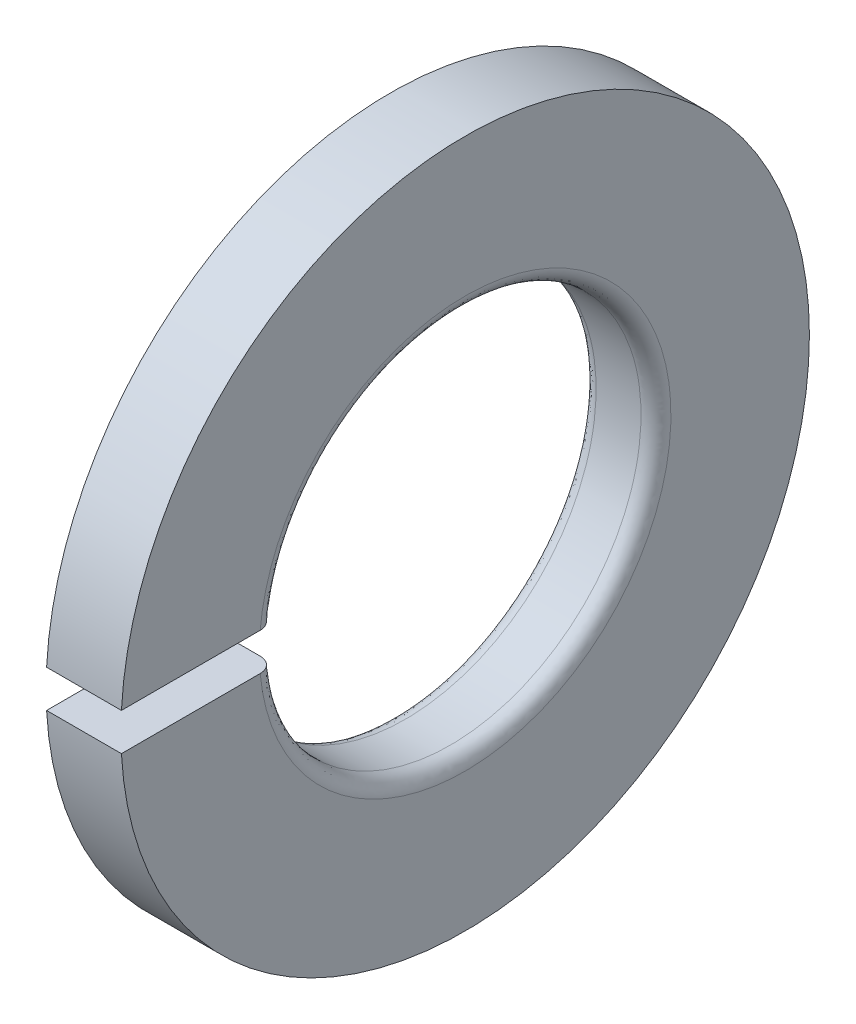
ISO-10303-21;
HEADER;
FILE_DESCRIPTION(('STEP AP214'),'2;1');
FILE_NAME('part.step','',(''),(''),'','','');
FILE_SCHEMA(('AUTOMOTIVE_DESIGN { 1 0 10303 214 1 1 1 1 }'));
ENDSEC;
DATA;
#1=APPLICATION_CONTEXT('core data for automotive mechanical design processes');
#2=APPLICATION_PROTOCOL_DEFINITION('international standard','automotive_design',2000,#1);
#3=PRODUCT_CONTEXT('',#1,'mechanical');
#4=PRODUCT('Part','Part','',(#3));
#5=PRODUCT_RELATED_PRODUCT_CATEGORY('part','',(#4));
#6=PRODUCT_DEFINITION_FORMATION('','',#4);
#7=PRODUCT_DEFINITION_CONTEXT('part definition',#1,'design');
#8=PRODUCT_DEFINITION('design','',#6,#7);
#9=PRODUCT_DEFINITION_SHAPE('','',#8);
#10=(LENGTH_UNIT() NAMED_UNIT(*) SI_UNIT(.MILLI.,.METRE.));
#11=(NAMED_UNIT(*) PLANE_ANGLE_UNIT() SI_UNIT($,.RADIAN.));
#12=(NAMED_UNIT(*) SI_UNIT($,.STERADIAN.) SOLID_ANGLE_UNIT());
#13=UNCERTAINTY_MEASURE_WITH_UNIT(LENGTH_MEASURE(1.E-05),#10,'distance_accuracy_value','');
#14=(GEOMETRIC_REPRESENTATION_CONTEXT(3) GLOBAL_UNCERTAINTY_ASSIGNED_CONTEXT((#13)) GLOBAL_UNIT_ASSIGNED_CONTEXT((#10,
#11,#12)) REPRESENTATION_CONTEXT('',''));
#15=CARTESIAN_POINT('',(0.,0.,0.));
#16=DIRECTION('',(0.,0.,1.));
#17=DIRECTION('',(1.,0.,0.));
#18=AXIS2_PLACEMENT_3D('',#15,#16,#17);
#19=CARTESIAN_POINT('',(-0.2,0.,0.));
#20=DIRECTION('',(-1.,0.,0.));
#21=DIRECTION('',(0.,0.,1.));
#22=AXIS2_PLACEMENT_3D('',#19,#20,#21);
#23=CYLINDRICAL_SURFACE('',#22,2.55);
#24=DIRECTION('',(-1.,0.,0.));
#25=VECTOR('',#24,1.);
#26=CARTESIAN_POINT('',(-0.5,-0.25,2.537715508));
#27=LINE('',#26,#25);
#28=CARTESIAN_POINT('',(-0.19999999981299,-0.25,2.537715508));
#29=VERTEX_POINT('',#28);
#30=CARTESIAN_POINT('',(-0.800000000280313,-0.25,2.53771550557416));
#31=VERTEX_POINT('',#30);
#32=EDGE_CURVE('E65',#29,#31,#27,.T.);
#33=ORIENTED_EDGE('',*,*,#32,.F.);
#34=CARTESIAN_POINT('',(-0.199999999625981,0.,-5.16164801872554E-09));
#35=DIRECTION('',(-1.,0.,0.));
#36=DIRECTION('',(0.,-1.,0.));
#37=AXIS2_PLACEMENT_3D('',#34,#35,#36);
#38=CIRCLE('',#37,2.55000000003291);
#39=CARTESIAN_POINT('',(-0.19999999981299,0.250000000483639,2.53771550547797));
#40=VERTEX_POINT('',#39);
#41=EDGE_CURVE('E87',#40,#29,#38,.T.);
#42=ORIENTED_EDGE('',*,*,#41,.F.);
#43=DIRECTION('',(1.,0.,0.));
#44=VECTOR('',#43,1.);
#45=CARTESIAN_POINT('',(-0.5,0.250000000967278,2.53771550799461));
#46=LINE('',#45,#44);
#47=CARTESIAN_POINT('',(-0.800000000186877,0.250000000483639,2.53771550547797));
#48=VERTEX_POINT('',#47);
#49=EDGE_CURVE('E70',#40,#48,#46,.F.);
#50=ORIENTED_EDGE('',*,*,#49,.T.);
#51=CARTESIAN_POINT('',(-0.800000000373751,0.,-5.16165452393857E-09));
#52=DIRECTION('',(1.,0.,0.));
#53=DIRECTION('',(0.,0.,-1.));
#54=AXIS2_PLACEMENT_3D('',#51,#52,#53);
#55=CIRCLE('',#54,2.55000000003292);
#56=EDGE_CURVE('E68',#31,#48,#55,.T.);
#57=ORIENTED_EDGE('',*,*,#56,.F.);
#58=EDGE_LOOP('',(#33,#42,#50,#57));
#59=FACE_BOUND('',#58,.T.);
#60=ADVANCED_FACE('F16',(#59),#23,.F.);
#61=CARTESIAN_POINT('',(-0.780033317,0.138777453,2.547221539));
#62=CARTESIAN_POINT('',(-0.780033317,4.968494374,2.284089416));
#63=CARTESIAN_POINT('',(-0.780033317,4.836879579,-2.550999167));
#64=CARTESIAN_POINT('',(-0.780033317,0.,-2.550999167));
#65=CARTESIAN_POINT('',(-0.780033317,-4.836879579,-2.550999167));
#66=CARTESIAN_POINT('',(-0.780033317,-4.968494374,2.284089416));
#67=CARTESIAN_POINT('',(-0.780033317,-0.138777453,2.547221539));
#68=CARTESIAN_POINT('',(-0.916010753,0.138035243,2.533598491));
#69=CARTESIAN_POINT('',(-0.916010753,4.941921877,2.271873651));
#70=CARTESIAN_POINT('',(-0.916010753,4.811010984,-2.537355915));
#71=CARTESIAN_POINT('',(-0.916010753,0.,-2.537355915));
#72=CARTESIAN_POINT('',(-0.916010753,-4.811010984,-2.537355915));
#73=CARTESIAN_POINT('',(-0.916010753,-4.941921877,2.271873651));
#74=CARTESIAN_POINT('',(-0.916010753,-0.138035243,2.533598491));
#75=CARTESIAN_POINT('',(-1.012644085,0.143292214,2.630088724));
#76=CARTESIAN_POINT('',(-1.012644085,5.130131333,2.358396286));
#77=CARTESIAN_POINT('',(-1.012644085,4.994234794,-2.633989247));
#78=CARTESIAN_POINT('',(-1.012644085,0.,-2.633989247));
#79=CARTESIAN_POINT('',(-1.012644085,-4.994234794,-2.633989247));
#80=CARTESIAN_POINT('',(-1.012644085,-5.130131333,2.358396286));
#81=CARTESIAN_POINT('',(-1.012644085,-0.143292214,2.630088724));
#82=CARTESIAN_POINT('',(-0.999000833,0.150689551,2.765864799));
#83=CARTESIAN_POINT('',(-0.999000833,5.394969964,2.480146472));
#84=CARTESIAN_POINT('',(-0.999000833,5.252057883,-2.769966683));
#85=CARTESIAN_POINT('',(-0.999000833,0.,-2.769966683));
#86=CARTESIAN_POINT('',(-0.999000833,-5.252057883,-2.769966683));
#87=CARTESIAN_POINT('',(-0.999000833,-5.394969964,2.480146472));
#88=CARTESIAN_POINT('',(-0.999000833,-0.150689551,2.765864799));
#89=(BOUNDED_SURFACE() B_SPLINE_SURFACE(3,3,((#61,#62,#63,#64,#65,#66,#67),(#68,#69,#70,#71,#72,
#73,#74),(#75,#76,#77,#78,#79,#80,#81),(#82,#83,#84,#85,#86,#87,#88)),.UNSPECIFIED.,.F.,.F.,
.F.) B_SPLINE_SURFACE_WITH_KNOTS((4,4),(4,3,4),(0.,1.),(0.,0.5,1.),
.UNSPECIFIED.) GEOMETRIC_REPRESENTATION_ITEM() RATIONAL_B_SPLINE_SURFACE(((1.,0.351473788500957,
0.351473788500957,1.,0.351473788500957,0.351473788500957,1.),(0.755320871106152,
0.265475488101522,0.265475488101522,0.755320871106152,0.265475488101522,0.265475488101522,
0.755320871106152),(0.755320871106152,0.265475488101522,0.265475488101522,0.755320871106152,
0.265475488101522,0.265475488101522,0.755320871106152),(1.,0.351473788500957,0.351473788500957,
1.,0.351473788500957,0.351473788500957,1.))) REPRESENTATION_ITEM('') SURFACE());
#90=CARTESIAN_POINT('',(-1.00000000001159,0.149603339444052,2.74592768641035));
#91=CARTESIAN_POINT('',(-1.00000000001159,5.3560815397739,2.46226889551411));
#92=CARTESIAN_POINT('',(-1.00000000001159,5.21419960824773,-2.75000000292305));
#93=CARTESIAN_POINT('',(-1.00000000001159,0.,-2.75000000292305));
#94=CARTESIAN_POINT('',(-1.00000000001159,-5.21419960824773,-2.75000000292305));
#95=CARTESIAN_POINT('',(-1.00000000001159,-5.3560815397739,2.46226889551411));
#96=CARTESIAN_POINT('',(-1.00000000001159,-0.149603339444052,2.74592768641035));
#97=(BOUNDED_CURVE() B_SPLINE_CURVE(3,(#90,#91,#92,#93,#94,#95,#96),.UNSPECIFIED.,.F.,
.F.) B_SPLINE_CURVE_WITH_KNOTS((4,3,4),(0.,0.5,1.),
.UNSPECIFIED.) CURVE() GEOMETRIC_REPRESENTATION_ITEM() RATIONAL_B_SPLINE_CURVE((0.956578308695323,
0.336212202154983,0.336212202154983,0.956578308695323,0.336212202154983,0.336212202154983,0.956578308695323)) REPRESENTATION_ITEM(''));
#98=CARTESIAN_POINT('',(-1.00000000000464,0.250000000827829,2.73861278928763));
#99=VERTEX_POINT('',#98);
#100=CARTESIAN_POINT('',(-1.00000000000464,-0.250000000827828,2.73861278928763));
#101=VERTEX_POINT('',#100);
#102=EDGE_CURVE('E82',#99,#101,#97,.T.);
#103=CARTESIAN_POINT('',(-0.800000000186876,-0.25,2.53771550818698));
#104=CARTESIAN_POINT('',(-0.811213319520025,-0.249999999999993,2.53770570875092));
#105=CARTESIAN_POINT('',(-0.822423437785705,-0.249999999999997,2.53866251704334));
#106=CARTESIAN_POINT('',(-0.844515758149658,-0.250000000000003,2.54243661608801));
#107=CARTESIAN_POINT('',(-0.855398255077773,-0.250000000000007,2.54525217841151));
#108=CARTESIAN_POINT('',(-0.876540344242708,-0.249999999999994,2.55267289486082));
#109=CARTESIAN_POINT('',(-0.886799666556314,-0.249999999999978,2.55727881816582));
#110=CARTESIAN_POINT('',(-0.906400477665358,-0.250000000000022,2.56814263111236));
#111=CARTESIAN_POINT('',(-0.915742089820553,-0.250000000000081,2.57440029830632));
#112=CARTESIAN_POINT('',(-0.93326824342417,-0.250000000000011,2.58840486343128));
#113=CARTESIAN_POINT('',(-0.941450067824369,-0.249999999999881,2.59615516123982));
#114=CARTESIAN_POINT('',(-0.956403599836143,-0.250000000000119,2.61291412422464));
#115=CARTESIAN_POINT('',(-0.963175277096617,-0.250000000000486,2.62192281647882));
#116=CARTESIAN_POINT('',(-0.975149911855466,-0.250000000000494,2.6409875972027));
#117=CARTESIAN_POINT('',(-0.980345244577474,-0.250000000000132,2.65104846965971));
#118=CARTESIAN_POINT('',(-0.988977880716481,-0.249999999999868,2.67189554575339));
#119=CARTESIAN_POINT('',(-0.992416113925033,-0.249999999999968,2.68268136235035));
#120=CARTESIAN_POINT('',(-0.996614045394206,-0.25000000000002,2.70104230897517));
#121=CARTESIAN_POINT('',(-0.997882954470255,-0.25000000000001,2.70850506331311));
#122=CARTESIAN_POINT('',(-0.999575850091069,-0.24999999999999,2.7235151283908));
#123=CARTESIAN_POINT('',(-1.0000010237238,-0.24999999999998,2.73106230528642));
#124=CARTESIAN_POINT('',(-1.00000000001159,-0.25,2.73861278928763));
#125=B_SPLINE_CURVE_WITH_KNOTS('',3,(#103,#104,#105,#106,#107,#108,#109,#110,#111,#112,#113,
#114,#115,#116,#117,#118,#119,#120,#121,#122,#123,#124),.UNSPECIFIED.,.F.,.F.,(4,2,2,2,2,2,2,2,
2,2,4),(0.,0.0335945579315814,0.0671579206839928,0.100735718974776,0.134308997501819,
0.167959672731201,0.201611072161223,0.235422739622835,0.269216496636191,0.291881473697847,
0.314514539748401),.UNSPECIFIED.);
#126=EDGE_CURVE('E78',#31,#101,#125,.T.);
#127=CARTESIAN_POINT('',(-1.00000000001159,0.25,2.73861278928763));
#128=CARTESIAN_POINT('',(-1.00000937611495,0.249999999999985,2.72727549149672));
#129=CARTESIAN_POINT('',(-0.99904451314827,0.249999999999992,2.71594087843008));
#130=CARTESIAN_POINT('',(-0.995235873774651,0.250000000000008,2.69359932256203));
#131=CARTESIAN_POINT('',(-0.992393365591188,0.250000000000015,2.68259216382774));
#132=CARTESIAN_POINT('',(-0.984896922695982,0.249999999999985,2.66120623322726));
#133=CARTESIAN_POINT('',(-0.980242067653374,0.249999999999947,2.6508277837262));
#134=CARTESIAN_POINT('',(-0.969254808965486,0.250000000000053,2.63100323082644));
#135=CARTESIAN_POINT('',(-0.96292274689501,0.250000000000196,2.62155693812461));
#136=CARTESIAN_POINT('',(-0.948768130436277,0.249999999999848,2.60387949659266));
#137=CARTESIAN_POINT('',(-0.940947840187982,0.249999999999358,2.59564653517358));
#138=CARTESIAN_POINT('',(-0.924030949429694,0.250000000000641,2.58061731863777));
#139=CARTESIAN_POINT('',(-0.914934418423052,0.250000000002414,2.57382098533357));
#140=CARTESIAN_POINT('',(-0.895761509702467,0.250000000002405,2.56188639700259));
#141=CARTESIAN_POINT('',(-0.885689022924804,0.250000000000638,2.5567418840585));
#142=CARTESIAN_POINT('',(-0.864822931140384,0.249999999999362,2.54822820001144));
#143=CARTESIAN_POINT('',(-0.854029802485482,0.249999999999853,2.54485786899391));
#144=CARTESIAN_POINT('',(-0.835971367442596,0.250000000000094,2.54085878488444));
#145=CARTESIAN_POINT('',(-0.82882296536651,0.250000000000047,2.53968077269813));
#146=CARTESIAN_POINT('',(-0.814450745670371,0.249999999999953,2.53810925984432));
#147=CARTESIAN_POINT('',(-0.807227049602917,0.249999999999906,2.5377146471501));
#148=CARTESIAN_POINT('',(-0.800000000186876,0.25,2.53771550818698));
#149=B_SPLINE_CURVE_WITH_KNOTS('',3,(#127,#128,#129,#130,#131,#132,#133,#134,#135,#136,#137,
#138,#139,#140,#141,#142,#143,#144,#145,#146,#147,#148),.UNSPECIFIED.,.F.,.F.,(4,2,2,2,2,2,2,2,
2,2,4),(0.,0.0339671155806587,0.0679113120787765,0.101872768365016,0.135827313476775,
0.16973060839448,0.203632057674078,0.237403513001599,0.271152861912067,0.292847530158628,
0.314511380986703),.UNSPECIFIED.);
#150=EDGE_CURVE('E135',#99,#48,#149,.T.);
#151=ORIENTED_EDGE('',*,*,#102,.T.);
#152=ORIENTED_EDGE('',*,*,#126,.F.);
#153=ORIENTED_EDGE('',*,*,#56,.T.);
#154=ORIENTED_EDGE('',*,*,#150,.F.);
#155=EDGE_LOOP('',(#151,#152,#153,#154));
#156=FACE_BOUND('',#155,.T.);
#157=ADVANCED_FACE('F79',(#156),#89,.T.);
#158=CARTESIAN_POINT('',(-1.,-0.25,2.537715508));
#159=DIRECTION('',(0.,1.,0.));
#160=DIRECTION('',(0.,0.,1.));
#161=AXIS2_PLACEMENT_3D('',#158,#159,#160);
#162=PLANE('',#161);
#163=ORIENTED_EDGE('',*,*,#126,.T.);
#164=DIRECTION('',(0.,0.,1.));
#165=VECTOR('',#164,1.);
#166=CARTESIAN_POINT('',(-1.,-0.2500000025072,-0.00339925099999928));
#167=LINE('',#166,#165);
#168=CARTESIAN_POINT('',(-1.,-0.2500000012536,4.59320149786485));
#169=VERTEX_POINT('',#168);
#170=EDGE_CURVE('E184',#101,#169,#167,.T.);
#171=ORIENTED_EDGE('',*,*,#170,.T.);
#172=DIRECTION('',(1.,0.,0.));
#173=VECTOR('',#172,1.);
#174=CARTESIAN_POINT('',(-0.5,-0.25,4.593201498));
#175=LINE('',#174,#173);
#176=CARTESIAN_POINT('',(0.,-0.2500000012536,4.59320149786485));
#177=VERTEX_POINT('',#176);
#178=EDGE_CURVE('E74',#169,#177,#175,.T.);
#179=ORIENTED_EDGE('',*,*,#178,.T.);
#180=DIRECTION('',(0.,0.,-1.));
#181=VECTOR('',#180,1.);
#182=CARTESIAN_POINT('',(0.,-0.2500000025072,-0.00339925099999928));
#183=LINE('',#182,#181);
#184=CARTESIAN_POINT('',(4.64247417518847E-12,-0.250000000827823,2.73861278928758));
#185=VERTEX_POINT('',#184);
#186=EDGE_CURVE('E187',#177,#185,#183,.T.);
#187=ORIENTED_EDGE('',*,*,#186,.T.);
#188=CARTESIAN_POINT('',(-0.199999999812991,-0.25,2.53771550818697));
#189=CARTESIAN_POINT('',(-0.188786680479869,-0.249999999999996,2.5377057087509));
#190=CARTESIAN_POINT('',(-0.177576562214214,-0.249999999999998,2.5386625170433));
#191=CARTESIAN_POINT('',(-0.1554842418503,-0.250000000000002,2.5424366160879));
#192=CARTESIAN_POINT('',(-0.144601744922198,-0.250000000000004,2.54525217841136));
#193=CARTESIAN_POINT('',(-0.123459655757278,-0.249999999999997,2.55267289486059));
#194=CARTESIAN_POINT('',(-0.113200333443674,-0.249999999999989,2.55727881816555));
#195=CARTESIAN_POINT('',(-0.093599522334631,-0.250000000000011,2.568142631112));
#196=CARTESIAN_POINT('',(-0.0842579101794357,-0.25000000000004,2.57440029830593));
#197=CARTESIAN_POINT('',(-0.0667317565758403,-0.250000000000005,2.5884048634308));
#198=CARTESIAN_POINT('',(-0.0585499321756609,-0.249999999999941,2.59615516123929));
#199=CARTESIAN_POINT('',(-0.0435964001639233,-0.250000000000059,2.61291412422401));
#200=CARTESIAN_POINT('',(-0.0368247229034649,-0.250000000000243,2.62192281647814));
#201=CARTESIAN_POINT('',(-0.024850088144662,-0.250000000000247,2.64098759720189));
#202=CARTESIAN_POINT('',(-0.0196547554226785,-0.250000000000066,2.65104846965882));
#203=CARTESIAN_POINT('',(-0.0110221192836969,-0.249999999999935,2.67189554575232));
#204=CARTESIAN_POINT('',(-0.00758388607514596,-0.249999999999985,2.68268136234919));
#205=CARTESIAN_POINT('',(-0.00338595460588654,-0.25000000000001,2.70104230897412));
#206=CARTESIAN_POINT('',(-0.0021170455297889,-0.250000000000005,2.70850506331226));
#207=CARTESIAN_POINT('',(-0.000424149908917052,-0.249999999999995,2.72351512839034));
#208=CARTESIAN_POINT('',(1.02372382591738E-06,-0.24999999999999,2.73106230528617));
#209=CARTESIAN_POINT('',(1.16061906991005E-11,-0.250000000000001,2.73861278928758));
#210=B_SPLINE_CURVE_WITH_KNOTS('',3,(#188,#189,#190,#191,#192,#193,#194,#195,#196,#197,#198,
#199,#200,#201,#202,#203,#204,#205,#206,#207,#208,#209),.UNSPECIFIED.,.F.,.F.,(4,2,2,2,2,2,2,2,
2,2,4),(0.,0.0335945579315022,0.0671579206838468,0.100735718974571,0.134308997501553,
0.167959672730787,0.201611072160661,0.235422739622017,0.269216496635121,0.291881473697384,
0.314514539748541),.UNSPECIFIED.);
#211=EDGE_CURVE('E91',#29,#185,#210,.T.);
#212=ORIENTED_EDGE('',*,*,#211,.F.);
#213=ORIENTED_EDGE('',*,*,#32,.T.);
#214=EDGE_LOOP('',(#163,#171,#179,#187,#212,#213));
#215=FACE_BOUND('',#214,.T.);
#216=ADVANCED_FACE('F88',(#215),#162,.T.);
#217=CARTESIAN_POINT('',(-0.000999167000000001,0.150689551,2.765864799));
#218=CARTESIAN_POINT('',(-0.000999167000000001,5.394969964,2.480146472));
#219=CARTESIAN_POINT('',(-0.000999167000000001,5.252057883,-2.769966683));
#220=CARTESIAN_POINT('',(-0.000999167000000001,0.,-2.769966683));
#221=CARTESIAN_POINT('',(-0.000999167000000001,-5.252057883,-2.769966683));
#222=CARTESIAN_POINT('',(-0.000999167000000001,-5.394969964,2.480146472));
#223=CARTESIAN_POINT('',(-0.000999167000000001,-0.150689551,2.765864799));
#224=CARTESIAN_POINT('',(0.012644085,0.143292214,2.630088724));
#225=CARTESIAN_POINT('',(0.012644085,5.130131333,2.358396286));
#226=CARTESIAN_POINT('',(0.012644085,4.994234794,-2.633989247));
#227=CARTESIAN_POINT('',(0.012644085,0.,-2.633989247));
#228=CARTESIAN_POINT('',(0.012644085,-4.994234794,-2.633989247));
#229=CARTESIAN_POINT('',(0.012644085,-5.130131333,2.358396286));
#230=CARTESIAN_POINT('',(0.012644085,-0.143292214,2.630088724));
#231=CARTESIAN_POINT('',(-0.083989247,0.138035243,2.533598491));
#232=CARTESIAN_POINT('',(-0.083989247,4.941921877,2.271873651));
#233=CARTESIAN_POINT('',(-0.083989247,4.811010984,-2.537355915));
#234=CARTESIAN_POINT('',(-0.083989247,0.,-2.537355915));
#235=CARTESIAN_POINT('',(-0.083989247,-4.811010984,-2.537355915));
#236=CARTESIAN_POINT('',(-0.083989247,-4.941921877,2.271873651));
#237=CARTESIAN_POINT('',(-0.083989247,-0.138035243,2.533598491));
#238=CARTESIAN_POINT('',(-0.219966683,0.138777453,2.547221539));
#239=CARTESIAN_POINT('',(-0.219966683,4.968494374,2.284089416));
#240=CARTESIAN_POINT('',(-0.219966683,4.836879579,-2.550999167));
#241=CARTESIAN_POINT('',(-0.219966683,0.,-2.550999167));
#242=CARTESIAN_POINT('',(-0.219966683,-4.836879579,-2.550999167));
#243=CARTESIAN_POINT('',(-0.219966683,-4.968494374,2.284089416));
#244=CARTESIAN_POINT('',(-0.219966683,-0.138777453,2.547221539));
#245=(BOUNDED_SURFACE() B_SPLINE_SURFACE(3,3,((#217,#218,#219,#220,#221,#222,#223),(#224,#225,
#226,#227,#228,#229,#230),(#231,#232,#233,#234,#235,#236,#237),(#238,#239,#240,#241,#242,#243,
#244)),.UNSPECIFIED.,.F.,.F.,.F.) B_SPLINE_SURFACE_WITH_KNOTS((4,4),(4,3,4),(0.,1.),(0.,0.5,1.),
.UNSPECIFIED.) GEOMETRIC_REPRESENTATION_ITEM() RATIONAL_B_SPLINE_SURFACE(((1.,0.351473788500957,
0.351473788500957,1.,0.351473788500957,0.351473788500957,1.),(0.755320871117974,
0.265475488105677,0.265475488105677,0.755320871117974,0.265475488105677,0.265475488105677,
0.755320871117974),(0.755320871117974,0.265475488105677,0.265475488105677,0.755320871117974,
0.265475488105677,0.265475488105677,0.755320871117974),(1.,0.351473788500957,0.351473788500957,
1.,0.351473788500957,0.351473788500957,1.))) REPRESENTATION_ITEM('') SURFACE());
#246=CARTESIAN_POINT('',(1.16061676450697E-11,-0.149603339444052,2.74592768641035));
#247=CARTESIAN_POINT('',(1.16061662642501E-11,-5.3560815397739,2.46226889551411));
#248=CARTESIAN_POINT('',(1.16061662642501E-11,-5.21419960824774,-2.75000000292306));
#249=CARTESIAN_POINT('',(1.16061676450697E-11,0.,-2.75000000292306));
#250=CARTESIAN_POINT('',(1.16061662642501E-11,5.21419960824774,-2.75000000292306));
#251=CARTESIAN_POINT('',(1.16061662642501E-11,5.3560815397739,2.46226889551411));
#252=CARTESIAN_POINT('',(1.16061676450697E-11,0.149603339444052,2.74592768641035));
#253=(BOUNDED_CURVE() B_SPLINE_CURVE(3,(#246,#247,#248,#249,#250,#251,#252),.UNSPECIFIED.,.F.,
.F.) B_SPLINE_CURVE_WITH_KNOTS((4,3,4),(0.,0.5,1.),
.UNSPECIFIED.) CURVE() GEOMETRIC_REPRESENTATION_ITEM() RATIONAL_B_SPLINE_CURVE((0.956578308697957,
0.336212202155909,0.336212202155909,0.956578308697957,0.336212202155909,0.336212202155909,0.956578308697957)) REPRESENTATION_ITEM(''));
#254=CARTESIAN_POINT('',(4.64247410425135E-12,0.250000000827824,2.73861278928758));
#255=VERTEX_POINT('',#254);
#256=EDGE_CURVE('E172',#185,#255,#253,.T.);
#257=CARTESIAN_POINT('',(-0.19999999981299,0.25,2.53771550818697));
#258=CARTESIAN_POINT('',(-0.188786680479869,0.249999999999994,2.5377057087509));
#259=CARTESIAN_POINT('',(-0.177576562214214,0.249999999999997,2.5386625170433));
#260=CARTESIAN_POINT('',(-0.1554842418503,0.250000000000003,2.5424366160879));
#261=CARTESIAN_POINT('',(-0.144601744922197,0.250000000000006,2.54525217841136));
#262=CARTESIAN_POINT('',(-0.123459655757278,0.249999999999994,2.55267289486059));
#263=CARTESIAN_POINT('',(-0.113200333443674,0.249999999999978,2.55727881816555));
#264=CARTESIAN_POINT('',(-0.093599522334631,0.250000000000022,2.568142631112));
#265=CARTESIAN_POINT('',(-0.0842579101794353,0.250000000000081,2.57440029830593));
#266=CARTESIAN_POINT('',(-0.0667317565758399,0.250000000000011,2.5884048634308));
#267=CARTESIAN_POINT('',(-0.0585499321756608,0.249999999999881,2.59615516123929));
#268=CARTESIAN_POINT('',(-0.0435964001639235,0.250000000000119,2.61291412422401));
#269=CARTESIAN_POINT('',(-0.0368247229034651,0.250000000000485,2.62192281647814));
#270=CARTESIAN_POINT('',(-0.0248500881446623,0.250000000000493,2.64098759720189));
#271=CARTESIAN_POINT('',(-0.0196547554226789,0.250000000000131,2.65104846965882));
#272=CARTESIAN_POINT('',(-0.0110221192836972,0.249999999999869,2.67189554575232));
#273=CARTESIAN_POINT('',(-0.00758388607514616,0.249999999999969,2.68268136234919));
#274=CARTESIAN_POINT('',(-0.00338595460588659,0.250000000000021,2.70104230897412));
#275=CARTESIAN_POINT('',(-0.00211704552978889,0.25000000000001,2.70850506331226));
#276=CARTESIAN_POINT('',(-0.00042414990891697,0.24999999999999,2.72351512839034));
#277=CARTESIAN_POINT('',(1.02372382599177E-06,0.249999999999979,2.73106230528617));
#278=CARTESIAN_POINT('',(1.16061910294966E-11,0.25,2.73861278928758));
#279=B_SPLINE_CURVE_WITH_KNOTS('',3,(#257,#258,#259,#260,#261,#262,#263,#264,#265,#266,#267,
#268,#269,#270,#271,#272,#273,#274,#275,#276,#277,#278),.UNSPECIFIED.,.F.,.F.,(4,2,2,2,2,2,2,2,
2,2,4),(0.,0.0335945579315021,0.0671579206838468,0.100735718974572,0.134308997501553,
0.167959672730786,0.20161107216066,0.235422739622015,0.269216496635119,0.291881473697382,
0.314514539748542),.UNSPECIFIED.);
#280=EDGE_CURVE('E151',#40,#255,#279,.T.);
#281=ORIENTED_EDGE('',*,*,#41,.T.);
#282=ORIENTED_EDGE('',*,*,#211,.T.);
#283=ORIENTED_EDGE('',*,*,#256,.T.);
#284=ORIENTED_EDGE('',*,*,#280,.F.);
#285=EDGE_LOOP('',(#281,#282,#283,#284));
#286=FACE_BOUND('',#285,.T.);
#287=ADVANCED_FACE('F115',(#286),#245,.T.);
#288=CARTESIAN_POINT('',(-1.,0.25,4.593201498));
#289=DIRECTION('',(0.,-1.,0.));
#290=DIRECTION('',(0.,0.,-1.));
#291=AXIS2_PLACEMENT_3D('',#288,#289,#290);
#292=PLANE('',#291);
#293=ORIENTED_EDGE('',*,*,#280,.T.);
#294=DIRECTION('',(0.,0.,1.));
#295=VECTOR('',#294,1.);
#296=CARTESIAN_POINT('',(0.,0.250000002507201,-0.00339925099999928));
#297=LINE('',#296,#295);
#298=CARTESIAN_POINT('',(0.,0.250000001253601,4.59320149786485));
#299=VERTEX_POINT('',#298);
#300=EDGE_CURVE('E155',#255,#299,#297,.T.);
#301=ORIENTED_EDGE('',*,*,#300,.T.);
#302=DIRECTION('',(-1.,0.,0.));
#303=VECTOR('',#302,1.);
#304=CARTESIAN_POINT('',(-0.5,0.25,4.593201498));
#305=LINE('',#304,#303);
#306=CARTESIAN_POINT('',(-1.,0.250000001253601,4.59320149786485));
#307=VERTEX_POINT('',#306);
#308=EDGE_CURVE('E41',#299,#307,#305,.T.);
#309=ORIENTED_EDGE('',*,*,#308,.T.);
#310=DIRECTION('',(0.,0.,-1.));
#311=VECTOR('',#310,1.);
#312=CARTESIAN_POINT('',(-1.,0.250000002507201,-0.00339925099999928));
#313=LINE('',#312,#311);
#314=EDGE_CURVE('E183',#307,#99,#313,.T.);
#315=ORIENTED_EDGE('',*,*,#314,.T.);
#316=ORIENTED_EDGE('',*,*,#150,.T.);
#317=ORIENTED_EDGE('',*,*,#49,.F.);
#318=EDGE_LOOP('',(#293,#301,#309,#315,#316,#317));
#319=FACE_BOUND('',#318,.T.);
#320=ADVANCED_FACE('F138',(#319),#292,.T.);
#321=CARTESIAN_POINT('',(-1.,-4.6552,4.648360707));
#322=DIRECTION('',(1.,0.,0.));
#323=DIRECTION('',(0.,0.,-1.));
#324=AXIS2_PLACEMENT_3D('',#321,#322,#323);
#325=PLANE('',#324);
#326=CARTESIAN_POINT('',(-1.,0.,0.));
#327=DIRECTION('',(-1.,0.,0.));
#328=DIRECTION('',(0.,0.,1.));
#329=AXIS2_PLACEMENT_3D('',#326,#327,#328);
#330=CIRCLE('',#329,4.6);
#331=EDGE_CURVE('E32',#307,#169,#330,.T.);
#332=ORIENTED_EDGE('',*,*,#331,.T.);
#333=ORIENTED_EDGE('',*,*,#170,.F.);
#334=ORIENTED_EDGE('',*,*,#102,.F.);
#335=ORIENTED_EDGE('',*,*,#314,.F.);
#336=EDGE_LOOP('',(#332,#333,#334,#335));
#337=FACE_BOUND('',#336,.T.);
#338=ADVANCED_FACE('F141',(#337),#325,.F.);
#339=CARTESIAN_POINT('',(0.,-4.6552,-4.655159209));
#340=DIRECTION('',(-1.,0.,0.));
#341=DIRECTION('',(0.,0.,1.));
#342=AXIS2_PLACEMENT_3D('',#339,#340,#341);
#343=PLANE('',#342);
#344=ORIENTED_EDGE('',*,*,#256,.F.);
#345=ORIENTED_EDGE('',*,*,#186,.F.);
#346=CARTESIAN_POINT('',(0.,0.,0.));
#347=DIRECTION('',(-1.,0.,0.));
#348=DIRECTION('',(0.,0.,1.));
#349=AXIS2_PLACEMENT_3D('',#346,#347,#348);
#350=CIRCLE('',#349,4.6);
#351=EDGE_CURVE('E10',#177,#299,#350,.F.);
#352=ORIENTED_EDGE('',*,*,#351,.T.);
#353=ORIENTED_EDGE('',*,*,#300,.F.);
#354=EDGE_LOOP('',(#344,#345,#352,#353));
#355=FACE_BOUND('',#354,.T.);
#356=ADVANCED_FACE('F18',(#355),#343,.F.);
#357=CARTESIAN_POINT('',(0.,0.,0.));
#358=DIRECTION('',(-1.,0.,0.));
#359=DIRECTION('',(0.,0.,1.));
#360=AXIS2_PLACEMENT_3D('',#357,#358,#359);
#361=CYLINDRICAL_SURFACE('',#360,4.6);
#362=ORIENTED_EDGE('',*,*,#351,.F.);
#363=ORIENTED_EDGE('',*,*,#178,.F.);
#364=ORIENTED_EDGE('',*,*,#331,.F.);
#365=ORIENTED_EDGE('',*,*,#308,.F.);
#366=EDGE_LOOP('',(#362,#363,#364,#365));
#367=FACE_BOUND('',#366,.T.);
#368=ADVANCED_FACE('F205',(#367),#361,.T.);
#369=CLOSED_SHELL('',(#60,#157,#216,#287,#320,#338,#356,#368));
#370=MANIFOLD_SOLID_BREP('B1',#369);
#371=ADVANCED_BREP_SHAPE_REPRESENTATION('',(#18,#370),#14);
#372=SHAPE_DEFINITION_REPRESENTATION(#9,#371);
ENDSEC;
END-ISO-10303-21;
